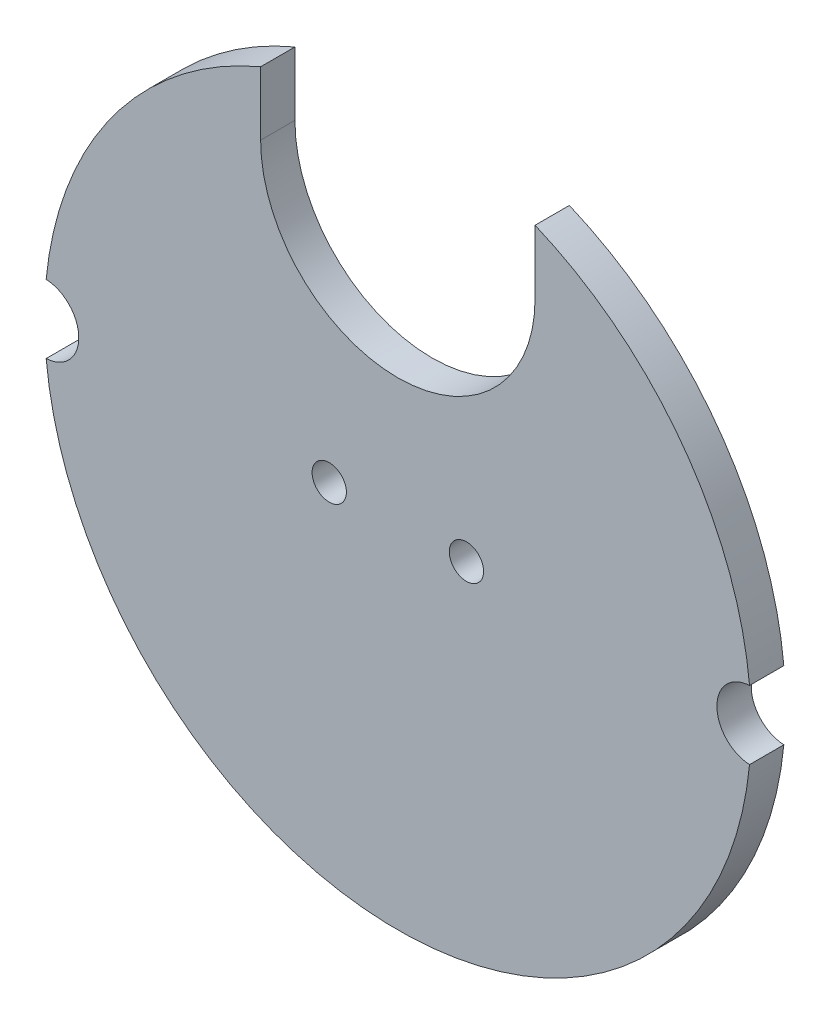
ISO-10303-21;
HEADER;
FILE_DESCRIPTION(('STEP AP214'),'2;1');
FILE_NAME('part.step','',(''),(''),'','','');
FILE_SCHEMA(('AUTOMOTIVE_DESIGN { 1 0 10303 214 1 1 1 1 }'));
ENDSEC;
DATA;
#1=APPLICATION_CONTEXT('core data for automotive mechanical design processes');
#2=APPLICATION_PROTOCOL_DEFINITION('international standard','automotive_design',2000,#1);
#3=PRODUCT_CONTEXT('',#1,'mechanical');
#4=PRODUCT('Part','Part','',(#3));
#5=PRODUCT_RELATED_PRODUCT_CATEGORY('part','',(#4));
#6=PRODUCT_DEFINITION_FORMATION('','',#4);
#7=PRODUCT_DEFINITION_CONTEXT('part definition',#1,'design');
#8=PRODUCT_DEFINITION('design','',#6,#7);
#9=PRODUCT_DEFINITION_SHAPE('','',#8);
#10=(LENGTH_UNIT() NAMED_UNIT(*) SI_UNIT(.MILLI.,.METRE.));
#11=(NAMED_UNIT(*) PLANE_ANGLE_UNIT() SI_UNIT($,.RADIAN.));
#12=(NAMED_UNIT(*) SI_UNIT($,.STERADIAN.) SOLID_ANGLE_UNIT());
#13=UNCERTAINTY_MEASURE_WITH_UNIT(LENGTH_MEASURE(1.E-05),#10,'distance_accuracy_value','');
#14=(GEOMETRIC_REPRESENTATION_CONTEXT(3) GLOBAL_UNCERTAINTY_ASSIGNED_CONTEXT((#13)) GLOBAL_UNIT_ASSIGNED_CONTEXT((#10,
#11,#12)) REPRESENTATION_CONTEXT('',''));
#15=CARTESIAN_POINT('',(0.,0.,0.));
#16=DIRECTION('',(0.,0.,1.));
#17=DIRECTION('',(1.,0.,0.));
#18=AXIS2_PLACEMENT_3D('',#15,#16,#17);
#19=CARTESIAN_POINT('',(0.,0.,6.35));
#20=DIRECTION('',(0.,0.,-1.));
#21=DIRECTION('',(-1.,0.,0.));
#22=AXIS2_PLACEMENT_3D('',#19,#20,#21);
#23=CYLINDRICAL_SURFACE('',#22,65.405);
#24=CARTESIAN_POINT('',(0.,0.,0.));
#25=DIRECTION('',(0.,0.,1.));
#26=DIRECTION('',(1.,0.,0.));
#27=AXIS2_PLACEMENT_3D('',#24,#25,#26);
#28=CIRCLE('',#27,65.405);
#29=CARTESIAN_POINT('',(-65.0967475728155,-6.34251373204149,0.));
#30=VERTEX_POINT('',#29);
#31=CARTESIAN_POINT('',(65.0967475728155,-6.34251373204151,0.));
#32=VERTEX_POINT('',#31);
#33=EDGE_CURVE('E121',#30,#32,#28,.T.);
#34=ORIENTED_EDGE('',*,*,#33,.T.);
#35=DIRECTION('',(0.,0.,1.));
#36=VECTOR('',#35,1.);
#37=CARTESIAN_POINT('',(65.0967475728155,-6.34251373204149,3.175));
#38=LINE('',#37,#36);
#39=CARTESIAN_POINT('',(65.0967475728155,-6.34251373204149,6.35));
#40=VERTEX_POINT('',#39);
#41=EDGE_CURVE('E52',#32,#40,#38,.T.);
#42=ORIENTED_EDGE('',*,*,#41,.T.);
#43=CARTESIAN_POINT('',(0.,0.,6.35));
#44=DIRECTION('',(0.,0.,1.));
#45=DIRECTION('',(1.,0.,0.));
#46=AXIS2_PLACEMENT_3D('',#43,#44,#45);
#47=CIRCLE('',#46,65.405);
#48=CARTESIAN_POINT('',(-65.0967475728155,-6.34251373204149,6.35));
#49=VERTEX_POINT('',#48);
#50=EDGE_CURVE('E132',#49,#40,#47,.T.);
#51=ORIENTED_EDGE('',*,*,#50,.F.);
#52=DIRECTION('',(0.,0.,1.));
#53=VECTOR('',#52,1.);
#54=CARTESIAN_POINT('',(-65.0967475728155,-6.34251373204149,3.175));
#55=LINE('',#54,#53);
#56=EDGE_CURVE('E151',#49,#30,#55,.F.);
#57=ORIENTED_EDGE('',*,*,#56,.T.);
#58=EDGE_LOOP('',(#34,#42,#51,#57));
#59=FACE_BOUND('',#58,.T.);
#60=ADVANCED_FACE('F37',(#59),#23,.T.);
#61=CARTESIAN_POINT('',(-25.4,60.2715025945098,0.));
#62=VERTEX_POINT('',#61);
#63=CARTESIAN_POINT('',(-65.0967475728155,6.34251373204151,0.));
#64=VERTEX_POINT('',#63);
#65=EDGE_CURVE('E124',#62,#64,#28,.T.);
#66=ORIENTED_EDGE('',*,*,#65,.T.);
#67=DIRECTION('',(0.,0.,1.));
#68=VECTOR('',#67,1.);
#69=CARTESIAN_POINT('',(-65.0967475728155,6.34251373204149,3.175));
#70=LINE('',#69,#68);
#71=CARTESIAN_POINT('',(-65.0967475728155,6.34251373204149,6.35));
#72=VERTEX_POINT('',#71);
#73=EDGE_CURVE('E60',#64,#72,#70,.T.);
#74=ORIENTED_EDGE('',*,*,#73,.T.);
#75=CARTESIAN_POINT('',(-25.4,60.2715025945098,6.35));
#76=VERTEX_POINT('',#75);
#77=EDGE_CURVE('E133',#76,#72,#47,.T.);
#78=ORIENTED_EDGE('',*,*,#77,.F.);
#79=DIRECTION('',(0.,0.,-1.));
#80=VECTOR('',#79,1.);
#81=CARTESIAN_POINT('',(-25.4,60.2715025945098,6.35));
#82=LINE('',#81,#80);
#83=EDGE_CURVE('E122',#76,#62,#82,.T.);
#84=ORIENTED_EDGE('',*,*,#83,.T.);
#85=EDGE_LOOP('',(#66,#74,#78,#84));
#86=FACE_BOUND('',#85,.T.);
#87=ADVANCED_FACE('F149',(#86),#23,.T.);
#88=CARTESIAN_POINT('',(65.0967475728155,6.34251373204149,6.35));
#89=VERTEX_POINT('',#88);
#90=CARTESIAN_POINT('',(25.4,60.2715025945098,6.35));
#91=VERTEX_POINT('',#90);
#92=EDGE_CURVE('E114',#89,#91,#47,.T.);
#93=ORIENTED_EDGE('',*,*,#92,.F.);
#94=DIRECTION('',(0.,0.,1.));
#95=VECTOR('',#94,1.);
#96=CARTESIAN_POINT('',(65.0967475728155,6.34251373204149,3.175));
#97=LINE('',#96,#95);
#98=CARTESIAN_POINT('',(65.0967475728155,6.34251373204149,0.));
#99=VERTEX_POINT('',#98);
#100=EDGE_CURVE('E101',#89,#99,#97,.F.);
#101=ORIENTED_EDGE('',*,*,#100,.T.);
#102=CARTESIAN_POINT('',(25.4,60.2715025945098,0.));
#103=VERTEX_POINT('',#102);
#104=EDGE_CURVE('E112',#99,#103,#28,.T.);
#105=ORIENTED_EDGE('',*,*,#104,.T.);
#106=DIRECTION('',(0.,0.,-1.));
#107=VECTOR('',#106,1.);
#108=CARTESIAN_POINT('',(25.4,60.2715025945098,6.35));
#109=LINE('',#108,#107);
#110=EDGE_CURVE('E126',#103,#91,#109,.F.);
#111=ORIENTED_EDGE('',*,*,#110,.T.);
#112=EDGE_LOOP('',(#93,#101,#105,#111));
#113=FACE_BOUND('',#112,.T.);
#114=ADVANCED_FACE('F39',(#113),#23,.T.);
#115=CARTESIAN_POINT('',(0.,0.,6.35));
#116=DIRECTION('',(0.,0.,1.));
#117=DIRECTION('',(1.,0.,0.));
#118=AXIS2_PLACEMENT_3D('',#115,#116,#117);
#119=PLANE('',#118);
#120=CARTESIAN_POINT('',(-12.7,0.,6.35));
#121=DIRECTION('',(0.,0.,1.));
#122=DIRECTION('',(1.,0.,0.));
#123=AXIS2_PLACEMENT_3D('',#120,#121,#122);
#124=CIRCLE('',#123,3.175);
#125=CARTESIAN_POINT('',(-9.525,0.,6.35));
#126=VERTEX_POINT('',#125);
#127=EDGE_CURVE('E202',#126,#126,#124,.T.);
#128=ORIENTED_EDGE('',*,*,#127,.F.);
#129=EDGE_LOOP('',(#128));
#130=FACE_BOUND('',#129,.T.);
#131=CARTESIAN_POINT('',(12.7,0.,6.35));
#132=DIRECTION('',(0.,0.,1.));
#133=DIRECTION('',(1.,0.,0.));
#134=AXIS2_PLACEMENT_3D('',#131,#132,#133);
#135=CIRCLE('',#134,3.175);
#136=CARTESIAN_POINT('',(15.875,0.,6.35));
#137=VERTEX_POINT('',#136);
#138=EDGE_CURVE('E205',#137,#137,#135,.T.);
#139=ORIENTED_EDGE('',*,*,#138,.F.);
#140=EDGE_LOOP('',(#139));
#141=FACE_BOUND('',#140,.T.);
#142=CARTESIAN_POINT('',(65.405,0.,6.35));
#143=DIRECTION('',(0.,0.,1.));
#144=DIRECTION('',(1.,0.,0.));
#145=AXIS2_PLACEMENT_3D('',#142,#143,#144);
#146=CIRCLE('',#145,6.35);
#147=EDGE_CURVE('E107',#89,#40,#146,.T.);
#148=ORIENTED_EDGE('',*,*,#147,.F.);
#149=ORIENTED_EDGE('',*,*,#92,.T.);
#150=DIRECTION('',(0.,1.,0.));
#151=VECTOR('',#150,1.);
#152=CARTESIAN_POINT('',(25.4,72.027407772319,6.35));
#153=LINE('',#152,#151);
#154=CARTESIAN_POINT('',(25.4,48.5097738640335,6.35));
#155=VERTEX_POINT('',#154);
#156=EDGE_CURVE('E154',#155,#91,#153,.T.);
#157=ORIENTED_EDGE('',*,*,#156,.F.);
#158=CARTESIAN_POINT('',(0.,48.5097738640335,6.35));
#159=DIRECTION('',(0.,0.,1.));
#160=DIRECTION('',(-1.,0.,0.));
#161=AXIS2_PLACEMENT_3D('',#158,#159,#160);
#162=CIRCLE('',#161,25.4);
#163=CARTESIAN_POINT('',(-25.4,48.5097738640335,6.35));
#164=VERTEX_POINT('',#163);
#165=EDGE_CURVE('E150',#164,#155,#162,.T.);
#166=ORIENTED_EDGE('',*,*,#165,.F.);
#167=DIRECTION('',(0.,-1.,0.));
#168=VECTOR('',#167,1.);
#169=CARTESIAN_POINT('',(-25.4,48.5097738640335,6.35));
#170=LINE('',#169,#168);
#171=EDGE_CURVE('E162',#76,#164,#170,.T.);
#172=ORIENTED_EDGE('',*,*,#171,.F.);
#173=ORIENTED_EDGE('',*,*,#77,.T.);
#174=CARTESIAN_POINT('',(-65.405,0.,6.35));
#175=DIRECTION('',(0.,0.,1.));
#176=DIRECTION('',(1.,0.,0.));
#177=AXIS2_PLACEMENT_3D('',#174,#175,#176);
#178=CIRCLE('',#177,6.35);
#179=EDGE_CURVE('E157',#49,#72,#178,.T.);
#180=ORIENTED_EDGE('',*,*,#179,.F.);
#181=ORIENTED_EDGE('',*,*,#50,.T.);
#182=EDGE_LOOP('',(#148,#149,#157,#166,#172,#173,#180,#181));
#183=FACE_BOUND('',#182,.T.);
#184=ADVANCED_FACE('F172',(#130,#141,#183),#119,.T.);
#185=CARTESIAN_POINT('',(0.,0.,0.));
#186=DIRECTION('',(0.,0.,1.));
#187=DIRECTION('',(1.,0.,0.));
#188=AXIS2_PLACEMENT_3D('',#185,#186,#187);
#189=PLANE('',#188);
#190=CARTESIAN_POINT('',(-12.7,0.,0.));
#191=DIRECTION('',(0.,0.,1.));
#192=DIRECTION('',(1.,0.,0.));
#193=AXIS2_PLACEMENT_3D('',#190,#191,#192);
#194=CIRCLE('',#193,3.175);
#195=CARTESIAN_POINT('',(-9.525,0.,0.));
#196=VERTEX_POINT('',#195);
#197=EDGE_CURVE('E208',#196,#196,#194,.T.);
#198=ORIENTED_EDGE('',*,*,#197,.T.);
#199=EDGE_LOOP('',(#198));
#200=FACE_BOUND('',#199,.T.);
#201=CARTESIAN_POINT('',(12.7,0.,0.));
#202=DIRECTION('',(0.,0.,1.));
#203=DIRECTION('',(1.,0.,0.));
#204=AXIS2_PLACEMENT_3D('',#201,#202,#203);
#205=CIRCLE('',#204,3.175);
#206=CARTESIAN_POINT('',(15.875,0.,0.));
#207=VERTEX_POINT('',#206);
#208=EDGE_CURVE('E207',#207,#207,#205,.T.);
#209=ORIENTED_EDGE('',*,*,#208,.T.);
#210=EDGE_LOOP('',(#209));
#211=FACE_BOUND('',#210,.T.);
#212=ORIENTED_EDGE('',*,*,#104,.F.);
#213=CARTESIAN_POINT('',(65.405,0.,0.));
#214=DIRECTION('',(0.,0.,1.));
#215=DIRECTION('',(1.,0.,0.));
#216=AXIS2_PLACEMENT_3D('',#213,#214,#215);
#217=CIRCLE('',#216,6.35);
#218=EDGE_CURVE('E98',#99,#32,#217,.T.);
#219=ORIENTED_EDGE('',*,*,#218,.T.);
#220=ORIENTED_EDGE('',*,*,#33,.F.);
#221=CARTESIAN_POINT('',(-65.405,0.,0.));
#222=DIRECTION('',(0.,0.,1.));
#223=DIRECTION('',(1.,0.,0.));
#224=AXIS2_PLACEMENT_3D('',#221,#222,#223);
#225=CIRCLE('',#224,6.35);
#226=EDGE_CURVE('E11',#30,#64,#225,.T.);
#227=ORIENTED_EDGE('',*,*,#226,.T.);
#228=ORIENTED_EDGE('',*,*,#65,.F.);
#229=DIRECTION('',(0.,-1.,0.));
#230=VECTOR('',#229,1.);
#231=CARTESIAN_POINT('',(-25.4,0.,0.));
#232=LINE('',#231,#230);
#233=CARTESIAN_POINT('',(-25.4,48.5097738640335,0.));
#234=VERTEX_POINT('',#233);
#235=EDGE_CURVE('E45',#62,#234,#232,.T.);
#236=ORIENTED_EDGE('',*,*,#235,.T.);
#237=CARTESIAN_POINT('',(0.,48.5097738640335,0.));
#238=DIRECTION('',(0.,0.,1.));
#239=DIRECTION('',(-1.,0.,0.));
#240=AXIS2_PLACEMENT_3D('',#237,#238,#239);
#241=CIRCLE('',#240,25.4);
#242=CARTESIAN_POINT('',(25.4,48.5097738640335,0.));
#243=VERTEX_POINT('',#242);
#244=EDGE_CURVE('E144',#234,#243,#241,.T.);
#245=ORIENTED_EDGE('',*,*,#244,.T.);
#246=DIRECTION('',(0.,1.,0.));
#247=VECTOR('',#246,1.);
#248=CARTESIAN_POINT('',(25.4,60.2715025945098,0.));
#249=LINE('',#248,#247);
#250=EDGE_CURVE('E120',#243,#103,#249,.T.);
#251=ORIENTED_EDGE('',*,*,#250,.T.);
#252=EDGE_LOOP('',(#212,#219,#220,#227,#228,#236,#245,#251));
#253=FACE_BOUND('',#252,.T.);
#254=ADVANCED_FACE('F117',(#200,#211,#253),#189,.F.);
#255=CARTESIAN_POINT('',(-25.4,48.5097738640335,0.));
#256=DIRECTION('',(-1.,0.,0.));
#257=DIRECTION('',(0.,0.,1.));
#258=AXIS2_PLACEMENT_3D('',#255,#256,#257);
#259=PLANE('',#258);
#260=ORIENTED_EDGE('',*,*,#171,.T.);
#261=DIRECTION('',(0.,0.,1.));
#262=VECTOR('',#261,1.);
#263=CARTESIAN_POINT('',(-25.4,48.5097738640335,0.));
#264=LINE('',#263,#262);
#265=EDGE_CURVE('E148',#234,#164,#264,.T.);
#266=ORIENTED_EDGE('',*,*,#265,.F.);
#267=ORIENTED_EDGE('',*,*,#235,.F.);
#268=ORIENTED_EDGE('',*,*,#83,.F.);
#269=EDGE_LOOP('',(#260,#266,#267,#268));
#270=FACE_BOUND('',#269,.T.);
#271=ADVANCED_FACE('F146',(#270),#259,.F.);
#272=CARTESIAN_POINT('',(25.4,72.027407772319,0.));
#273=DIRECTION('',(1.,0.,0.));
#274=DIRECTION('',(0.,1.,0.));
#275=AXIS2_PLACEMENT_3D('',#272,#273,#274);
#276=PLANE('',#275);
#277=ORIENTED_EDGE('',*,*,#250,.F.);
#278=DIRECTION('',(0.,0.,1.));
#279=VECTOR('',#278,1.);
#280=CARTESIAN_POINT('',(25.4,48.5097738640335,0.));
#281=LINE('',#280,#279);
#282=EDGE_CURVE('E163',#243,#155,#281,.T.);
#283=ORIENTED_EDGE('',*,*,#282,.T.);
#284=ORIENTED_EDGE('',*,*,#156,.T.);
#285=ORIENTED_EDGE('',*,*,#110,.F.);
#286=EDGE_LOOP('',(#277,#283,#284,#285));
#287=FACE_BOUND('',#286,.T.);
#288=ADVANCED_FACE('F170',(#287),#276,.F.);
#289=CARTESIAN_POINT('',(0.,48.5097738640335,0.));
#290=DIRECTION('',(0.,0.,1.));
#291=DIRECTION('',(1.,0.,0.));
#292=AXIS2_PLACEMENT_3D('',#289,#290,#291);
#293=CYLINDRICAL_SURFACE('',#292,25.4);
#294=ORIENTED_EDGE('',*,*,#165,.T.);
#295=ORIENTED_EDGE('',*,*,#282,.F.);
#296=ORIENTED_EDGE('',*,*,#244,.F.);
#297=ORIENTED_EDGE('',*,*,#265,.T.);
#298=EDGE_LOOP('',(#294,#295,#296,#297));
#299=FACE_BOUND('',#298,.T.);
#300=ADVANCED_FACE('F174',(#299),#293,.F.);
#301=CARTESIAN_POINT('',(-65.405,0.,0.));
#302=DIRECTION('',(0.,0.,1.));
#303=DIRECTION('',(1.,0.,0.));
#304=AXIS2_PLACEMENT_3D('',#301,#302,#303);
#305=CYLINDRICAL_SURFACE('',#304,6.35);
#306=ORIENTED_EDGE('',*,*,#226,.F.);
#307=ORIENTED_EDGE('',*,*,#56,.F.);
#308=ORIENTED_EDGE('',*,*,#179,.T.);
#309=ORIENTED_EDGE('',*,*,#73,.F.);
#310=EDGE_LOOP('',(#306,#307,#308,#309));
#311=FACE_BOUND('',#310,.T.);
#312=ADVANCED_FACE('F176',(#311),#305,.F.);
#313=CARTESIAN_POINT('',(65.405,0.,0.));
#314=DIRECTION('',(0.,0.,1.));
#315=DIRECTION('',(1.,0.,0.));
#316=AXIS2_PLACEMENT_3D('',#313,#314,#315);
#317=CYLINDRICAL_SURFACE('',#316,6.35);
#318=ORIENTED_EDGE('',*,*,#218,.F.);
#319=ORIENTED_EDGE('',*,*,#100,.F.);
#320=ORIENTED_EDGE('',*,*,#147,.T.);
#321=ORIENTED_EDGE('',*,*,#41,.F.);
#322=EDGE_LOOP('',(#318,#319,#320,#321));
#323=FACE_BOUND('',#322,.T.);
#324=ADVANCED_FACE('F100',(#323),#317,.F.);
#325=CARTESIAN_POINT('',(12.7,0.,0.));
#326=DIRECTION('',(0.,0.,1.));
#327=DIRECTION('',(1.,0.,0.));
#328=AXIS2_PLACEMENT_3D('',#325,#326,#327);
#329=CYLINDRICAL_SURFACE('',#328,3.175);
#330=ORIENTED_EDGE('',*,*,#208,.F.);
#331=EDGE_LOOP('',(#330));
#332=FACE_BOUND('',#331,.T.);
#333=ORIENTED_EDGE('',*,*,#138,.T.);
#334=EDGE_LOOP('',(#333));
#335=FACE_BOUND('',#334,.T.);
#336=ADVANCED_FACE('F221',(#332,#335),#329,.F.);
#337=CARTESIAN_POINT('',(-12.7,0.,0.));
#338=DIRECTION('',(0.,0.,1.));
#339=DIRECTION('',(1.,0.,0.));
#340=AXIS2_PLACEMENT_3D('',#337,#338,#339);
#341=CYLINDRICAL_SURFACE('',#340,3.175);
#342=ORIENTED_EDGE('',*,*,#197,.F.);
#343=EDGE_LOOP('',(#342));
#344=FACE_BOUND('',#343,.T.);
#345=ORIENTED_EDGE('',*,*,#127,.T.);
#346=EDGE_LOOP('',(#345));
#347=FACE_BOUND('',#346,.T.);
#348=ADVANCED_FACE('F219',(#344,#347),#341,.F.);
#349=CLOSED_SHELL('',(#60,#87,#114,#184,#254,#271,#288,#300,#312,#324,#336,#348));
#350=MANIFOLD_SOLID_BREP('B2',#349);
#351=ADVANCED_BREP_SHAPE_REPRESENTATION('',(#18,#350),#14);
#352=SHAPE_DEFINITION_REPRESENTATION(#9,#351);
ENDSEC;
END-ISO-10303-21;
